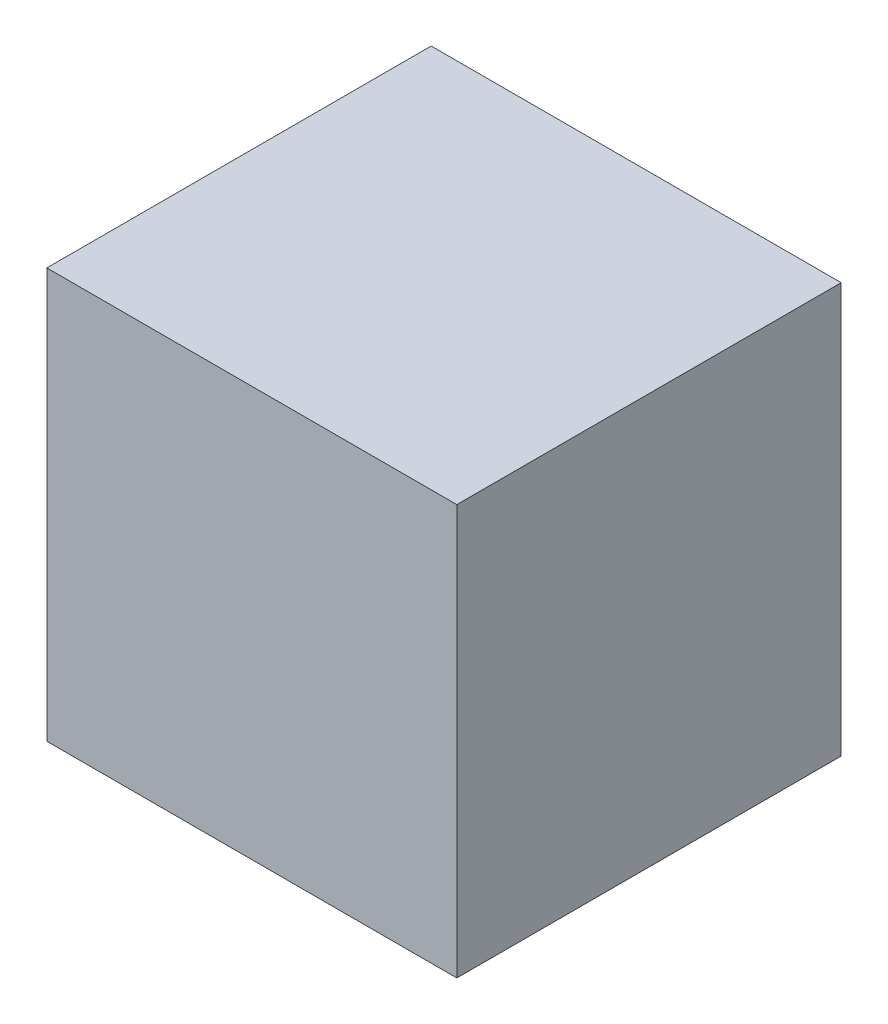
ISO-10303-21;
HEADER;
FILE_DESCRIPTION(('STEP AP214'),'2;1');
FILE_NAME('part.step','',(''),(''),'','','');
FILE_SCHEMA(('AUTOMOTIVE_DESIGN { 1 0 10303 214 1 1 1 1 }'));
ENDSEC;
DATA;
#1=APPLICATION_CONTEXT('core data for automotive mechanical design processes');
#2=APPLICATION_PROTOCOL_DEFINITION('international standard','automotive_design',2000,#1);
#3=PRODUCT_CONTEXT('',#1,'mechanical');
#4=PRODUCT('Part','Part','',(#3));
#5=PRODUCT_RELATED_PRODUCT_CATEGORY('part','',(#4));
#6=PRODUCT_DEFINITION_FORMATION('','',#4);
#7=PRODUCT_DEFINITION_CONTEXT('part definition',#1,'design');
#8=PRODUCT_DEFINITION('design','',#6,#7);
#9=PRODUCT_DEFINITION_SHAPE('','',#8);
#10=(LENGTH_UNIT() NAMED_UNIT(*) SI_UNIT(.MILLI.,.METRE.));
#11=(NAMED_UNIT(*) PLANE_ANGLE_UNIT() SI_UNIT($,.RADIAN.));
#12=(NAMED_UNIT(*) SI_UNIT($,.STERADIAN.) SOLID_ANGLE_UNIT());
#13=UNCERTAINTY_MEASURE_WITH_UNIT(LENGTH_MEASURE(1.E-05),#10,'distance_accuracy_value','');
#14=(GEOMETRIC_REPRESENTATION_CONTEXT(3) GLOBAL_UNCERTAINTY_ASSIGNED_CONTEXT((#13)) GLOBAL_UNIT_ASSIGNED_CONTEXT((#10,
#11,#12)) REPRESENTATION_CONTEXT('',''));
#15=CARTESIAN_POINT('',(0.,0.,0.));
#16=DIRECTION('',(0.,0.,1.));
#17=DIRECTION('',(1.,0.,0.));
#18=AXIS2_PLACEMENT_3D('',#15,#16,#17);
#19=CARTESIAN_POINT('',(0.,16.,0.));
#20=DIRECTION('',(1.,0.,0.));
#21=DIRECTION('',(0.,0.,-1.));
#22=AXIS2_PLACEMENT_3D('',#19,#20,#21);
#23=PLANE('',#22);
#24=DIRECTION('',(0.,0.,1.));
#25=VECTOR('',#24,1.);
#26=CARTESIAN_POINT('',(0.,0.,0.));
#27=LINE('',#26,#25);
#28=CARTESIAN_POINT('',(0.,0.,0.));
#29=VERTEX_POINT('',#28);
#30=CARTESIAN_POINT('',(0.,0.,15.));
#31=VERTEX_POINT('',#30);
#32=EDGE_CURVE('E113',#29,#31,#27,.T.);
#33=ORIENTED_EDGE('',*,*,#32,.T.);
#34=DIRECTION('',(0.,-1.,0.));
#35=VECTOR('',#34,1.);
#36=CARTESIAN_POINT('',(0.,16.,15.));
#37=LINE('',#36,#35);
#38=CARTESIAN_POINT('',(0.,16.,15.));
#39=VERTEX_POINT('',#38);
#40=EDGE_CURVE('E11',#39,#31,#37,.T.);
#41=ORIENTED_EDGE('',*,*,#40,.F.);
#42=DIRECTION('',(0.,0.,1.));
#43=VECTOR('',#42,1.);
#44=CARTESIAN_POINT('',(0.,16.,0.));
#45=LINE('',#44,#43);
#46=CARTESIAN_POINT('',(0.,16.,0.));
#47=VERTEX_POINT('',#46);
#48=EDGE_CURVE('E97',#47,#39,#45,.T.);
#49=ORIENTED_EDGE('',*,*,#48,.F.);
#50=DIRECTION('',(0.,-1.,0.));
#51=VECTOR('',#50,1.);
#52=CARTESIAN_POINT('',(0.,16.,0.));
#53=LINE('',#52,#51);
#54=EDGE_CURVE('E109',#47,#29,#53,.T.);
#55=ORIENTED_EDGE('',*,*,#54,.T.);
#56=EDGE_LOOP('',(#33,#41,#49,#55));
#57=FACE_BOUND('',#56,.T.);
#58=ADVANCED_FACE('F45',(#57),#23,.F.);
#59=CARTESIAN_POINT('',(0.,16.,15.));
#60=DIRECTION('',(0.,0.,-1.));
#61=DIRECTION('',(-1.,0.,0.));
#62=AXIS2_PLACEMENT_3D('',#59,#60,#61);
#63=PLANE('',#62);
#64=DIRECTION('',(1.,0.,0.));
#65=VECTOR('',#64,1.);
#66=CARTESIAN_POINT('',(0.,0.,15.));
#67=LINE('',#66,#65);
#68=CARTESIAN_POINT('',(16.,0.,15.));
#69=VERTEX_POINT('',#68);
#70=EDGE_CURVE('E102',#31,#69,#67,.T.);
#71=ORIENTED_EDGE('',*,*,#70,.T.);
#72=DIRECTION('',(0.,-1.,0.));
#73=VECTOR('',#72,1.);
#74=CARTESIAN_POINT('',(16.,16.,15.));
#75=LINE('',#74,#73);
#76=CARTESIAN_POINT('',(16.,16.,15.));
#77=VERTEX_POINT('',#76);
#78=EDGE_CURVE('E54',#77,#69,#75,.T.);
#79=ORIENTED_EDGE('',*,*,#78,.F.);
#80=DIRECTION('',(1.,0.,0.));
#81=VECTOR('',#80,1.);
#82=CARTESIAN_POINT('',(0.,16.,15.));
#83=LINE('',#82,#81);
#84=EDGE_CURVE('E92',#39,#77,#83,.T.);
#85=ORIENTED_EDGE('',*,*,#84,.F.);
#86=ORIENTED_EDGE('',*,*,#40,.T.);
#87=EDGE_LOOP('',(#71,#79,#85,#86));
#88=FACE_BOUND('',#87,.T.);
#89=ADVANCED_FACE('F101',(#88),#63,.F.);
#90=CARTESIAN_POINT('',(16.,16.,0.));
#91=DIRECTION('',(-1.,0.,0.));
#92=DIRECTION('',(0.,0.,1.));
#93=AXIS2_PLACEMENT_3D('',#90,#91,#92);
#94=PLANE('',#93);
#95=DIRECTION('',(0.,0.,-1.));
#96=VECTOR('',#95,1.);
#97=CARTESIAN_POINT('',(16.,0.,0.));
#98=LINE('',#97,#96);
#99=CARTESIAN_POINT('',(16.,0.,0.));
#100=VERTEX_POINT('',#99);
#101=EDGE_CURVE('E79',#69,#100,#98,.T.);
#102=ORIENTED_EDGE('',*,*,#101,.T.);
#103=DIRECTION('',(0.,-1.,0.));
#104=VECTOR('',#103,1.);
#105=CARTESIAN_POINT('',(16.,16.,0.));
#106=LINE('',#105,#104);
#107=CARTESIAN_POINT('',(16.,16.,0.));
#108=VERTEX_POINT('',#107);
#109=EDGE_CURVE('E104',#108,#100,#106,.T.);
#110=ORIENTED_EDGE('',*,*,#109,.F.);
#111=DIRECTION('',(0.,0.,-1.));
#112=VECTOR('',#111,1.);
#113=CARTESIAN_POINT('',(16.,16.,0.));
#114=LINE('',#113,#112);
#115=EDGE_CURVE('E95',#77,#108,#114,.T.);
#116=ORIENTED_EDGE('',*,*,#115,.F.);
#117=ORIENTED_EDGE('',*,*,#78,.T.);
#118=EDGE_LOOP('',(#102,#110,#116,#117));
#119=FACE_BOUND('',#118,.T.);
#120=ADVANCED_FACE('F105',(#119),#94,.F.);
#121=CARTESIAN_POINT('',(0.,16.,0.));
#122=DIRECTION('',(0.,0.,1.));
#123=DIRECTION('',(1.,0.,0.));
#124=AXIS2_PLACEMENT_3D('',#121,#122,#123);
#125=PLANE('',#124);
#126=DIRECTION('',(-1.,0.,0.));
#127=VECTOR('',#126,1.);
#128=CARTESIAN_POINT('',(0.,0.,0.));
#129=LINE('',#128,#127);
#130=EDGE_CURVE('E85',#100,#29,#129,.T.);
#131=ORIENTED_EDGE('',*,*,#130,.T.);
#132=ORIENTED_EDGE('',*,*,#54,.F.);
#133=DIRECTION('',(-1.,0.,0.));
#134=VECTOR('',#133,1.);
#135=CARTESIAN_POINT('',(0.,16.,0.));
#136=LINE('',#135,#134);
#137=EDGE_CURVE('E62',#108,#47,#136,.T.);
#138=ORIENTED_EDGE('',*,*,#137,.F.);
#139=ORIENTED_EDGE('',*,*,#109,.T.);
#140=EDGE_LOOP('',(#131,#132,#138,#139));
#141=FACE_BOUND('',#140,.T.);
#142=ADVANCED_FACE('F126',(#141),#125,.F.);
#143=CARTESIAN_POINT('',(0.,16.,0.));
#144=DIRECTION('',(0.,1.,0.));
#145=DIRECTION('',(0.,0.,1.));
#146=AXIS2_PLACEMENT_3D('',#143,#144,#145);
#147=PLANE('',#146);
#148=ORIENTED_EDGE('',*,*,#48,.T.);
#149=ORIENTED_EDGE('',*,*,#84,.T.);
#150=ORIENTED_EDGE('',*,*,#115,.T.);
#151=ORIENTED_EDGE('',*,*,#137,.T.);
#152=EDGE_LOOP('',(#148,#149,#150,#151));
#153=FACE_BOUND('',#152,.T.);
#154=ADVANCED_FACE('F93',(#153),#147,.T.);
#155=CARTESIAN_POINT('',(0.,0.,0.));
#156=DIRECTION('',(0.,1.,0.));
#157=DIRECTION('',(0.,0.,1.));
#158=AXIS2_PLACEMENT_3D('',#155,#156,#157);
#159=PLANE('',#158);
#160=ORIENTED_EDGE('',*,*,#32,.F.);
#161=ORIENTED_EDGE('',*,*,#130,.F.);
#162=ORIENTED_EDGE('',*,*,#101,.F.);
#163=ORIENTED_EDGE('',*,*,#70,.F.);
#164=EDGE_LOOP('',(#160,#161,#162,#163));
#165=FACE_BOUND('',#164,.T.);
#166=ADVANCED_FACE('F129',(#165),#159,.F.);
#167=CLOSED_SHELL('',(#58,#89,#120,#142,#154,#166));
#168=MANIFOLD_SOLID_BREP('B2',#167);
#169=ADVANCED_BREP_SHAPE_REPRESENTATION('',(#18,#168),#14);
#170=SHAPE_DEFINITION_REPRESENTATION(#9,#169);
ENDSEC;
END-ISO-10303-21;
